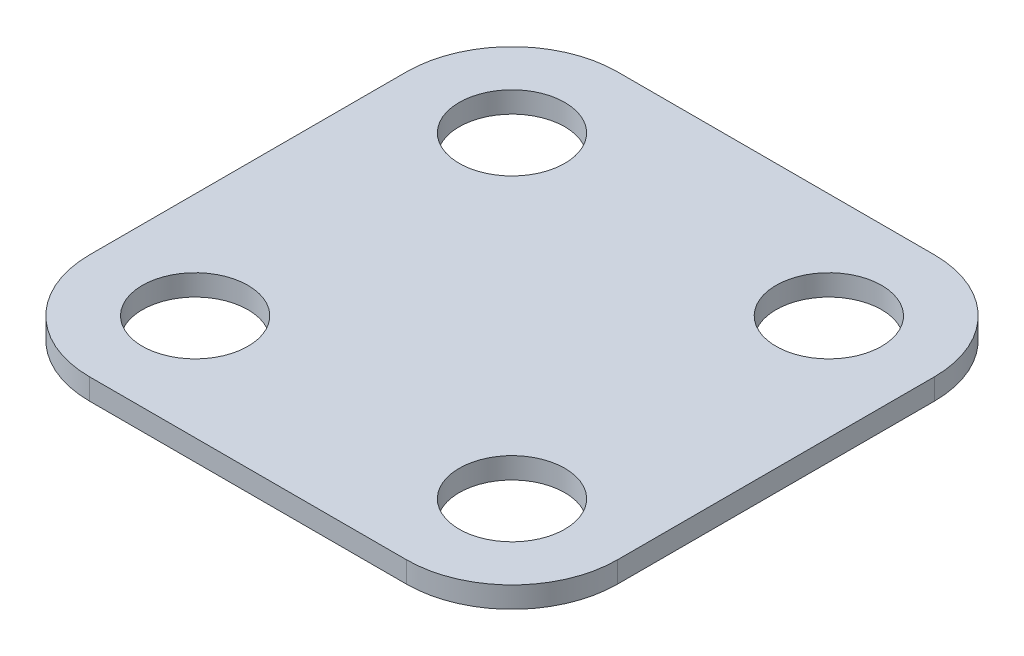
ISO-10303-21;
HEADER;
FILE_DESCRIPTION(('STEP AP214'),'2;1');
FILE_NAME('part.step','',(''),(''),'','','');
FILE_SCHEMA(('AUTOMOTIVE_DESIGN { 1 0 10303 214 1 1 1 1 }'));
ENDSEC;
DATA;
#1=APPLICATION_CONTEXT('core data for automotive mechanical design processes');
#2=APPLICATION_PROTOCOL_DEFINITION('international standard','automotive_design',2000,#1);
#3=PRODUCT_CONTEXT('',#1,'mechanical');
#4=PRODUCT('Part','Part','',(#3));
#5=PRODUCT_RELATED_PRODUCT_CATEGORY('part','',(#4));
#6=PRODUCT_DEFINITION_FORMATION('','',#4);
#7=PRODUCT_DEFINITION_CONTEXT('part definition',#1,'design');
#8=PRODUCT_DEFINITION('design','',#6,#7);
#9=PRODUCT_DEFINITION_SHAPE('','',#8);
#10=(LENGTH_UNIT() NAMED_UNIT(*) SI_UNIT(.MILLI.,.METRE.));
#11=(NAMED_UNIT(*) PLANE_ANGLE_UNIT() SI_UNIT($,.RADIAN.));
#12=(NAMED_UNIT(*) SI_UNIT($,.STERADIAN.) SOLID_ANGLE_UNIT());
#13=UNCERTAINTY_MEASURE_WITH_UNIT(LENGTH_MEASURE(1.E-05),#10,'distance_accuracy_value','');
#14=(GEOMETRIC_REPRESENTATION_CONTEXT(3) GLOBAL_UNCERTAINTY_ASSIGNED_CONTEXT((#13)) GLOBAL_UNIT_ASSIGNED_CONTEXT((#10,
#11,#12)) REPRESENTATION_CONTEXT('',''));
#15=CARTESIAN_POINT('',(0.,0.,0.));
#16=DIRECTION('',(0.,0.,1.));
#17=DIRECTION('',(1.,0.,0.));
#18=AXIS2_PLACEMENT_3D('',#15,#16,#17);
#19=CARTESIAN_POINT('',(-15.,-2.,15.));
#20=DIRECTION('',(0.,1.,0.));
#21=DIRECTION('',(0.,0.,-1.));
#22=AXIS2_PLACEMENT_3D('',#19,#20,#21);
#23=CYLINDRICAL_SURFACE('',#22,10.);
#24=CARTESIAN_POINT('',(-15.,0.,15.));
#25=DIRECTION('',(0.,-1.,0.));
#26=DIRECTION('',(0.,0.,-1.));
#27=AXIS2_PLACEMENT_3D('',#24,#25,#26);
#28=CIRCLE('',#27,10.);
#29=CARTESIAN_POINT('',(-15.,0.,25.));
#30=VERTEX_POINT('',#29);
#31=CARTESIAN_POINT('',(-25.,0.,15.));
#32=VERTEX_POINT('',#31);
#33=EDGE_CURVE('E131',#30,#32,#28,.T.);
#34=ORIENTED_EDGE('',*,*,#33,.T.);
#35=DIRECTION('',(0.,1.,0.));
#36=VECTOR('',#35,1.);
#37=CARTESIAN_POINT('',(-25.,-2.,15.));
#38=LINE('',#37,#36);
#39=CARTESIAN_POINT('',(-25.,-2.,15.));
#40=VERTEX_POINT('',#39);
#41=EDGE_CURVE('E38',#40,#32,#38,.T.);
#42=ORIENTED_EDGE('',*,*,#41,.F.);
#43=CARTESIAN_POINT('',(-15.,-2.,15.));
#44=DIRECTION('',(0.,-1.,0.));
#45=DIRECTION('',(0.,0.,-1.));
#46=AXIS2_PLACEMENT_3D('',#43,#44,#45);
#47=CIRCLE('',#46,10.);
#48=CARTESIAN_POINT('',(-15.,-2.,25.));
#49=VERTEX_POINT('',#48);
#50=EDGE_CURVE('E145',#49,#40,#47,.T.);
#51=ORIENTED_EDGE('',*,*,#50,.F.);
#52=DIRECTION('',(0.,1.,0.));
#53=VECTOR('',#52,1.);
#54=CARTESIAN_POINT('',(-15.,-2.,25.));
#55=LINE('',#54,#53);
#56=EDGE_CURVE('E11',#49,#30,#55,.T.);
#57=ORIENTED_EDGE('',*,*,#56,.T.);
#58=EDGE_LOOP('',(#34,#42,#51,#57));
#59=FACE_BOUND('',#58,.T.);
#60=ADVANCED_FACE('F35',(#59),#23,.T.);
#61=CARTESIAN_POINT('',(-15.,-2.,25.));
#62=DIRECTION('',(0.,0.,1.));
#63=DIRECTION('',(-1.,0.,0.));
#64=AXIS2_PLACEMENT_3D('',#61,#62,#63);
#65=PLANE('',#64);
#66=DIRECTION('',(-1.,0.,0.));
#67=VECTOR('',#66,1.);
#68=CARTESIAN_POINT('',(-15.,0.,25.));
#69=LINE('',#68,#67);
#70=CARTESIAN_POINT('',(15.,0.,25.));
#71=VERTEX_POINT('',#70);
#72=EDGE_CURVE('E88',#71,#30,#69,.T.);
#73=ORIENTED_EDGE('',*,*,#72,.T.);
#74=ORIENTED_EDGE('',*,*,#56,.F.);
#75=DIRECTION('',(-1.,0.,0.));
#76=VECTOR('',#75,1.);
#77=CARTESIAN_POINT('',(-15.,-2.,25.));
#78=LINE('',#77,#76);
#79=CARTESIAN_POINT('',(15.,-2.,25.));
#80=VERTEX_POINT('',#79);
#81=EDGE_CURVE('E53',#80,#49,#78,.T.);
#82=ORIENTED_EDGE('',*,*,#81,.F.);
#83=DIRECTION('',(0.,1.,0.));
#84=VECTOR('',#83,1.);
#85=CARTESIAN_POINT('',(15.,-2.,25.));
#86=LINE('',#85,#84);
#87=EDGE_CURVE('E44',#80,#71,#86,.T.);
#88=ORIENTED_EDGE('',*,*,#87,.T.);
#89=EDGE_LOOP('',(#73,#74,#82,#88));
#90=FACE_BOUND('',#89,.T.);
#91=ADVANCED_FACE('F232',(#90),#65,.T.);
#92=CARTESIAN_POINT('',(15.,-2.,15.));
#93=DIRECTION('',(0.,1.,0.));
#94=DIRECTION('',(0.,0.,-1.));
#95=AXIS2_PLACEMENT_3D('',#92,#93,#94);
#96=CYLINDRICAL_SURFACE('',#95,10.);
#97=CARTESIAN_POINT('',(15.,0.,15.));
#98=DIRECTION('',(0.,-1.,0.));
#99=DIRECTION('',(0.,0.,1.));
#100=AXIS2_PLACEMENT_3D('',#97,#98,#99);
#101=CIRCLE('',#100,10.);
#102=CARTESIAN_POINT('',(25.,0.,15.));
#103=VERTEX_POINT('',#102);
#104=EDGE_CURVE('E82',#103,#71,#101,.T.);
#105=ORIENTED_EDGE('',*,*,#104,.T.);
#106=ORIENTED_EDGE('',*,*,#87,.F.);
#107=CARTESIAN_POINT('',(15.,-2.,15.));
#108=DIRECTION('',(0.,-1.,0.));
#109=DIRECTION('',(0.,0.,1.));
#110=AXIS2_PLACEMENT_3D('',#107,#108,#109);
#111=CIRCLE('',#110,10.);
#112=CARTESIAN_POINT('',(25.,-2.,15.));
#113=VERTEX_POINT('',#112);
#114=EDGE_CURVE('E113',#113,#80,#111,.T.);
#115=ORIENTED_EDGE('',*,*,#114,.F.);
#116=DIRECTION('',(0.,1.,0.));
#117=VECTOR('',#116,1.);
#118=CARTESIAN_POINT('',(25.,-2.,15.));
#119=LINE('',#118,#117);
#120=EDGE_CURVE('E120',#113,#103,#119,.T.);
#121=ORIENTED_EDGE('',*,*,#120,.T.);
#122=EDGE_LOOP('',(#105,#106,#115,#121));
#123=FACE_BOUND('',#122,.T.);
#124=ADVANCED_FACE('F126',(#123),#96,.T.);
#125=CARTESIAN_POINT('',(25.,-2.,15.));
#126=DIRECTION('',(1.,0.,0.));
#127=DIRECTION('',(0.,0.,1.));
#128=AXIS2_PLACEMENT_3D('',#125,#126,#127);
#129=PLANE('',#128);
#130=DIRECTION('',(0.,0.,1.));
#131=VECTOR('',#130,1.);
#132=CARTESIAN_POINT('',(25.,0.,15.));
#133=LINE('',#132,#131);
#134=CARTESIAN_POINT('',(25.,0.,-15.));
#135=VERTEX_POINT('',#134);
#136=EDGE_CURVE('E123',#135,#103,#133,.T.);
#137=ORIENTED_EDGE('',*,*,#136,.T.);
#138=ORIENTED_EDGE('',*,*,#120,.F.);
#139=DIRECTION('',(0.,0.,1.));
#140=VECTOR('',#139,1.);
#141=CARTESIAN_POINT('',(25.,-2.,15.));
#142=LINE('',#141,#140);
#143=CARTESIAN_POINT('',(25.,-2.,-15.));
#144=VERTEX_POINT('',#143);
#145=EDGE_CURVE('E109',#144,#113,#142,.T.);
#146=ORIENTED_EDGE('',*,*,#145,.F.);
#147=DIRECTION('',(0.,1.,0.));
#148=VECTOR('',#147,1.);
#149=CARTESIAN_POINT('',(25.,-2.,-15.));
#150=LINE('',#149,#148);
#151=EDGE_CURVE('E124',#144,#135,#150,.T.);
#152=ORIENTED_EDGE('',*,*,#151,.T.);
#153=EDGE_LOOP('',(#137,#138,#146,#152));
#154=FACE_BOUND('',#153,.T.);
#155=ADVANCED_FACE('F121',(#154),#129,.T.);
#156=CARTESIAN_POINT('',(15.,-2.,-15.));
#157=DIRECTION('',(0.,1.,0.));
#158=DIRECTION('',(0.,0.,-1.));
#159=AXIS2_PLACEMENT_3D('',#156,#157,#158);
#160=CYLINDRICAL_SURFACE('',#159,10.);
#161=CARTESIAN_POINT('',(15.,0.,-15.));
#162=DIRECTION('',(0.,-1.,0.));
#163=DIRECTION('',(0.,0.,-1.));
#164=AXIS2_PLACEMENT_3D('',#161,#162,#163);
#165=CIRCLE('',#164,10.);
#166=CARTESIAN_POINT('',(15.,0.,-25.));
#167=VERTEX_POINT('',#166);
#168=EDGE_CURVE('E141',#167,#135,#165,.T.);
#169=ORIENTED_EDGE('',*,*,#168,.T.);
#170=ORIENTED_EDGE('',*,*,#151,.F.);
#171=CARTESIAN_POINT('',(15.,-2.,-15.));
#172=DIRECTION('',(0.,-1.,0.));
#173=DIRECTION('',(0.,0.,-1.));
#174=AXIS2_PLACEMENT_3D('',#171,#172,#173);
#175=CIRCLE('',#174,10.);
#176=CARTESIAN_POINT('',(15.,-2.,-25.));
#177=VERTEX_POINT('',#176);
#178=EDGE_CURVE('E115',#177,#144,#175,.T.);
#179=ORIENTED_EDGE('',*,*,#178,.F.);
#180=DIRECTION('',(0.,1.,0.));
#181=VECTOR('',#180,1.);
#182=CARTESIAN_POINT('',(15.,-2.,-25.));
#183=LINE('',#182,#181);
#184=EDGE_CURVE('E149',#177,#167,#183,.T.);
#185=ORIENTED_EDGE('',*,*,#184,.T.);
#186=EDGE_LOOP('',(#169,#170,#179,#185));
#187=FACE_BOUND('',#186,.T.);
#188=ADVANCED_FACE('F243',(#187),#160,.T.);
#189=CARTESIAN_POINT('',(-15.,-2.,-25.));
#190=DIRECTION('',(0.,0.,-1.));
#191=DIRECTION('',(1.,0.,0.));
#192=AXIS2_PLACEMENT_3D('',#189,#190,#191);
#193=PLANE('',#192);
#194=DIRECTION('',(1.,0.,0.));
#195=VECTOR('',#194,1.);
#196=CARTESIAN_POINT('',(-15.,0.,-25.));
#197=LINE('',#196,#195);
#198=CARTESIAN_POINT('',(-15.,0.,-25.));
#199=VERTEX_POINT('',#198);
#200=EDGE_CURVE('E139',#199,#167,#197,.T.);
#201=ORIENTED_EDGE('',*,*,#200,.T.);
#202=ORIENTED_EDGE('',*,*,#184,.F.);
#203=DIRECTION('',(1.,0.,0.));
#204=VECTOR('',#203,1.);
#205=CARTESIAN_POINT('',(-15.,-2.,-25.));
#206=LINE('',#205,#204);
#207=CARTESIAN_POINT('',(-15.,-2.,-25.));
#208=VERTEX_POINT('',#207);
#209=EDGE_CURVE('E174',#208,#177,#206,.T.);
#210=ORIENTED_EDGE('',*,*,#209,.F.);
#211=DIRECTION('',(0.,1.,0.));
#212=VECTOR('',#211,1.);
#213=CARTESIAN_POINT('',(-15.,-2.,-25.));
#214=LINE('',#213,#212);
#215=EDGE_CURVE('E152',#208,#199,#214,.T.);
#216=ORIENTED_EDGE('',*,*,#215,.T.);
#217=EDGE_LOOP('',(#201,#202,#210,#216));
#218=FACE_BOUND('',#217,.T.);
#219=ADVANCED_FACE('F172',(#218),#193,.T.);
#220=CARTESIAN_POINT('',(-15.,-2.,-15.));
#221=DIRECTION('',(0.,1.,0.));
#222=DIRECTION('',(0.,0.,-1.));
#223=AXIS2_PLACEMENT_3D('',#220,#221,#222);
#224=CYLINDRICAL_SURFACE('',#223,10.);
#225=CARTESIAN_POINT('',(-15.,0.,-15.));
#226=DIRECTION('',(0.,-1.,0.));
#227=DIRECTION('',(0.,0.,-1.));
#228=AXIS2_PLACEMENT_3D('',#225,#226,#227);
#229=CIRCLE('',#228,10.);
#230=CARTESIAN_POINT('',(-25.,0.,-15.));
#231=VERTEX_POINT('',#230);
#232=EDGE_CURVE('E137',#231,#199,#229,.T.);
#233=ORIENTED_EDGE('',*,*,#232,.T.);
#234=ORIENTED_EDGE('',*,*,#215,.F.);
#235=CARTESIAN_POINT('',(-15.,-2.,-15.));
#236=DIRECTION('',(0.,-1.,0.));
#237=DIRECTION('',(0.,0.,-1.));
#238=AXIS2_PLACEMENT_3D('',#235,#236,#237);
#239=CIRCLE('',#238,10.);
#240=CARTESIAN_POINT('',(-25.,-2.,-15.));
#241=VERTEX_POINT('',#240);
#242=EDGE_CURVE('E175',#241,#208,#239,.T.);
#243=ORIENTED_EDGE('',*,*,#242,.F.);
#244=DIRECTION('',(0.,1.,0.));
#245=VECTOR('',#244,1.);
#246=CARTESIAN_POINT('',(-25.,-2.,-15.));
#247=LINE('',#246,#245);
#248=EDGE_CURVE('E154',#241,#231,#247,.T.);
#249=ORIENTED_EDGE('',*,*,#248,.T.);
#250=EDGE_LOOP('',(#233,#234,#243,#249));
#251=FACE_BOUND('',#250,.T.);
#252=ADVANCED_FACE('F169',(#251),#224,.T.);
#253=CARTESIAN_POINT('',(-25.,-2.,15.));
#254=DIRECTION('',(-1.,0.,0.));
#255=DIRECTION('',(0.,0.,-1.));
#256=AXIS2_PLACEMENT_3D('',#253,#254,#255);
#257=PLANE('',#256);
#258=DIRECTION('',(0.,0.,-1.));
#259=VECTOR('',#258,1.);
#260=CARTESIAN_POINT('',(-25.,0.,15.));
#261=LINE('',#260,#259);
#262=EDGE_CURVE('E134',#32,#231,#261,.T.);
#263=ORIENTED_EDGE('',*,*,#262,.T.);
#264=ORIENTED_EDGE('',*,*,#248,.F.);
#265=DIRECTION('',(0.,0.,-1.));
#266=VECTOR('',#265,1.);
#267=CARTESIAN_POINT('',(-25.,-2.,15.));
#268=LINE('',#267,#266);
#269=EDGE_CURVE('E96',#40,#241,#268,.T.);
#270=ORIENTED_EDGE('',*,*,#269,.F.);
#271=ORIENTED_EDGE('',*,*,#41,.T.);
#272=EDGE_LOOP('',(#263,#264,#270,#271));
#273=FACE_BOUND('',#272,.T.);
#274=ADVANCED_FACE('F160',(#273),#257,.T.);
#275=CARTESIAN_POINT('',(-15.,-2.,15.));
#276=DIRECTION('',(0.,1.,0.));
#277=DIRECTION('',(0.,0.,-1.));
#278=AXIS2_PLACEMENT_3D('',#275,#276,#277);
#279=PLANE('',#278);
#280=CARTESIAN_POINT('',(-15.,-2.,14.9999999999985));
#281=DIRECTION('',(0.,-1.,0.));
#282=DIRECTION('',(0.,0.,-1.));
#283=AXIS2_PLACEMENT_3D('',#280,#281,#282);
#284=CIRCLE('',#283,5.);
#285=CARTESIAN_POINT('',(-15.,-2.,9.99999999999852));
#286=VERTEX_POINT('',#285);
#287=EDGE_CURVE('E196',#286,#286,#284,.T.);
#288=ORIENTED_EDGE('',*,*,#287,.F.);
#289=EDGE_LOOP('',(#288));
#290=FACE_BOUND('',#289,.T.);
#291=CARTESIAN_POINT('',(-14.9999999999985,-2.,-15.0000000000015));
#292=DIRECTION('',(0.,-1.,0.));
#293=DIRECTION('',(0.,0.,-1.));
#294=AXIS2_PLACEMENT_3D('',#291,#292,#293);
#295=CIRCLE('',#294,5.);
#296=CARTESIAN_POINT('',(-14.9999999999985,-2.,-20.0000000000015));
#297=VERTEX_POINT('',#296);
#298=EDGE_CURVE('E190',#297,#297,#295,.T.);
#299=ORIENTED_EDGE('',*,*,#298,.F.);
#300=EDGE_LOOP('',(#299));
#301=FACE_BOUND('',#300,.T.);
#302=CARTESIAN_POINT('',(15.0000000000015,-2.,-15.));
#303=DIRECTION('',(0.,-1.,0.));
#304=DIRECTION('',(0.,0.,-1.));
#305=AXIS2_PLACEMENT_3D('',#302,#303,#304);
#306=CIRCLE('',#305,5.);
#307=CARTESIAN_POINT('',(15.0000000000015,-2.,-20.));
#308=VERTEX_POINT('',#307);
#309=EDGE_CURVE('E184',#308,#308,#306,.T.);
#310=ORIENTED_EDGE('',*,*,#309,.F.);
#311=EDGE_LOOP('',(#310));
#312=FACE_BOUND('',#311,.T.);
#313=CARTESIAN_POINT('',(15.,-2.,15.));
#314=DIRECTION('',(0.,-1.,0.));
#315=DIRECTION('',(0.,0.,-1.));
#316=AXIS2_PLACEMENT_3D('',#313,#314,#315);
#317=CIRCLE('',#316,4.99999999999999);
#318=CARTESIAN_POINT('',(15.,-2.,10.));
#319=VERTEX_POINT('',#318);
#320=EDGE_CURVE('E135',#319,#319,#317,.T.);
#321=ORIENTED_EDGE('',*,*,#320,.F.);
#322=EDGE_LOOP('',(#321));
#323=FACE_BOUND('',#322,.T.);
#324=ORIENTED_EDGE('',*,*,#50,.T.);
#325=ORIENTED_EDGE('',*,*,#269,.T.);
#326=ORIENTED_EDGE('',*,*,#242,.T.);
#327=ORIENTED_EDGE('',*,*,#209,.T.);
#328=ORIENTED_EDGE('',*,*,#178,.T.);
#329=ORIENTED_EDGE('',*,*,#145,.T.);
#330=ORIENTED_EDGE('',*,*,#114,.T.);
#331=ORIENTED_EDGE('',*,*,#81,.T.);
#332=EDGE_LOOP('',(#324,#325,#326,#327,#328,#329,#330,#331));
#333=FACE_BOUND('',#332,.T.);
#334=ADVANCED_FACE('F111',(#290,#301,#312,#323,#333),#279,.F.);
#335=CARTESIAN_POINT('',(-15.,0.,15.));
#336=DIRECTION('',(0.,1.,0.));
#337=DIRECTION('',(0.,0.,-1.));
#338=AXIS2_PLACEMENT_3D('',#335,#336,#337);
#339=PLANE('',#338);
#340=CARTESIAN_POINT('',(-15.,0.,14.9999999999985));
#341=DIRECTION('',(0.,-1.,0.));
#342=DIRECTION('',(0.,0.,-1.));
#343=AXIS2_PLACEMENT_3D('',#340,#341,#342);
#344=CIRCLE('',#343,5.);
#345=CARTESIAN_POINT('',(-15.,0.,9.99999999999852));
#346=VERTEX_POINT('',#345);
#347=EDGE_CURVE('E199',#346,#346,#344,.T.);
#348=ORIENTED_EDGE('',*,*,#347,.T.);
#349=EDGE_LOOP('',(#348));
#350=FACE_BOUND('',#349,.T.);
#351=CARTESIAN_POINT('',(-14.9999999999985,0.,-15.0000000000015));
#352=DIRECTION('',(0.,-1.,0.));
#353=DIRECTION('',(0.,0.,-1.));
#354=AXIS2_PLACEMENT_3D('',#351,#352,#353);
#355=CIRCLE('',#354,5.);
#356=CARTESIAN_POINT('',(-14.9999999999985,0.,-20.0000000000015));
#357=VERTEX_POINT('',#356);
#358=EDGE_CURVE('E193',#357,#357,#355,.T.);
#359=ORIENTED_EDGE('',*,*,#358,.T.);
#360=EDGE_LOOP('',(#359));
#361=FACE_BOUND('',#360,.T.);
#362=CARTESIAN_POINT('',(15.0000000000015,0.,-15.));
#363=DIRECTION('',(0.,-1.,0.));
#364=DIRECTION('',(0.,0.,-1.));
#365=AXIS2_PLACEMENT_3D('',#362,#363,#364);
#366=CIRCLE('',#365,5.);
#367=CARTESIAN_POINT('',(15.0000000000015,0.,-20.));
#368=VERTEX_POINT('',#367);
#369=EDGE_CURVE('E187',#368,#368,#366,.T.);
#370=ORIENTED_EDGE('',*,*,#369,.T.);
#371=EDGE_LOOP('',(#370));
#372=FACE_BOUND('',#371,.T.);
#373=CARTESIAN_POINT('',(15.,0.,15.));
#374=DIRECTION('',(0.,-1.,0.));
#375=DIRECTION('',(0.,0.,-1.));
#376=AXIS2_PLACEMENT_3D('',#373,#374,#375);
#377=CIRCLE('',#376,4.99999999999999);
#378=CARTESIAN_POINT('',(15.,0.,10.));
#379=VERTEX_POINT('',#378);
#380=EDGE_CURVE('E181',#379,#379,#377,.T.);
#381=ORIENTED_EDGE('',*,*,#380,.T.);
#382=EDGE_LOOP('',(#381));
#383=FACE_BOUND('',#382,.T.);
#384=ORIENTED_EDGE('',*,*,#33,.F.);
#385=ORIENTED_EDGE('',*,*,#72,.F.);
#386=ORIENTED_EDGE('',*,*,#104,.F.);
#387=ORIENTED_EDGE('',*,*,#136,.F.);
#388=ORIENTED_EDGE('',*,*,#168,.F.);
#389=ORIENTED_EDGE('',*,*,#200,.F.);
#390=ORIENTED_EDGE('',*,*,#232,.F.);
#391=ORIENTED_EDGE('',*,*,#262,.F.);
#392=EDGE_LOOP('',(#384,#385,#386,#387,#388,#389,#390,#391));
#393=FACE_BOUND('',#392,.T.);
#394=ADVANCED_FACE('F165',(#350,#361,#372,#383,#393),#339,.T.);
#395=CARTESIAN_POINT('',(15.,-2.,15.));
#396=DIRECTION('',(0.,1.,0.));
#397=DIRECTION('',(0.,0.,-1.));
#398=AXIS2_PLACEMENT_3D('',#395,#396,#397);
#399=CYLINDRICAL_SURFACE('',#398,4.99999999999999);
#400=ORIENTED_EDGE('',*,*,#320,.T.);
#401=EDGE_LOOP('',(#400));
#402=FACE_BOUND('',#401,.T.);
#403=ORIENTED_EDGE('',*,*,#380,.F.);
#404=EDGE_LOOP('',(#403));
#405=FACE_BOUND('',#404,.T.);
#406=ADVANCED_FACE('F217',(#402,#405),#399,.F.);
#407=CARTESIAN_POINT('',(15.0000000000015,-2.,-15.));
#408=DIRECTION('',(0.,1.,0.));
#409=DIRECTION('',(0.,0.,-1.));
#410=AXIS2_PLACEMENT_3D('',#407,#408,#409);
#411=CYLINDRICAL_SURFACE('',#410,5.);
#412=ORIENTED_EDGE('',*,*,#309,.T.);
#413=EDGE_LOOP('',(#412));
#414=FACE_BOUND('',#413,.T.);
#415=ORIENTED_EDGE('',*,*,#369,.F.);
#416=EDGE_LOOP('',(#415));
#417=FACE_BOUND('',#416,.T.);
#418=ADVANCED_FACE('F220',(#414,#417),#411,.F.);
#419=CARTESIAN_POINT('',(-14.9999999999985,-2.,-15.0000000000015));
#420=DIRECTION('',(0.,1.,0.));
#421=DIRECTION('',(0.,0.,-1.));
#422=AXIS2_PLACEMENT_3D('',#419,#420,#421);
#423=CYLINDRICAL_SURFACE('',#422,5.);
#424=ORIENTED_EDGE('',*,*,#298,.T.);
#425=EDGE_LOOP('',(#424));
#426=FACE_BOUND('',#425,.T.);
#427=ORIENTED_EDGE('',*,*,#358,.F.);
#428=EDGE_LOOP('',(#427));
#429=FACE_BOUND('',#428,.T.);
#430=ADVANCED_FACE('F278',(#426,#429),#423,.F.);
#431=CARTESIAN_POINT('',(-15.,-2.,14.9999999999985));
#432=DIRECTION('',(0.,1.,0.));
#433=DIRECTION('',(0.,0.,-1.));
#434=AXIS2_PLACEMENT_3D('',#431,#432,#433);
#435=CYLINDRICAL_SURFACE('',#434,5.);
#436=ORIENTED_EDGE('',*,*,#287,.T.);
#437=EDGE_LOOP('',(#436));
#438=FACE_BOUND('',#437,.T.);
#439=ORIENTED_EDGE('',*,*,#347,.F.);
#440=EDGE_LOOP('',(#439));
#441=FACE_BOUND('',#440,.T.);
#442=ADVANCED_FACE('F205',(#438,#441),#435,.F.);
#443=CLOSED_SHELL('',(#60,#91,#124,#155,#188,#219,#252,#274,#334,#394,#406,#418,#430,#442));
#444=MANIFOLD_SOLID_BREP('B2',#443);
#445=ADVANCED_BREP_SHAPE_REPRESENTATION('',(#18,#444),#14);
#446=SHAPE_DEFINITION_REPRESENTATION(#9,#445);
ENDSEC;
END-ISO-10303-21;
